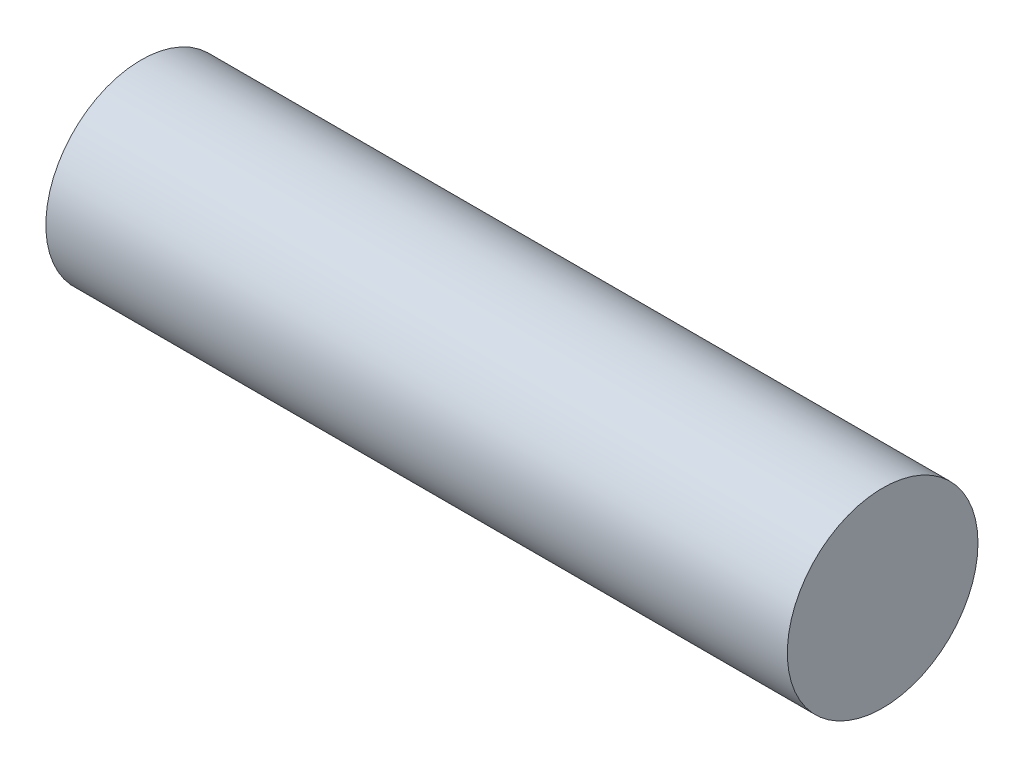
ISO-10303-21;
HEADER;
FILE_DESCRIPTION(('STEP AP214'),'2;1');
FILE_NAME('part.step','',(''),(''),'','','');
FILE_SCHEMA(('AUTOMOTIVE_DESIGN { 1 0 10303 214 1 1 1 1 }'));
ENDSEC;
DATA;
#1=APPLICATION_CONTEXT('core data for automotive mechanical design processes');
#2=APPLICATION_PROTOCOL_DEFINITION('international standard','automotive_design',2000,#1);
#3=PRODUCT_CONTEXT('',#1,'mechanical');
#4=PRODUCT('Part','Part','',(#3));
#5=PRODUCT_RELATED_PRODUCT_CATEGORY('part','',(#4));
#6=PRODUCT_DEFINITION_FORMATION('','',#4);
#7=PRODUCT_DEFINITION_CONTEXT('part definition',#1,'design');
#8=PRODUCT_DEFINITION('design','',#6,#7);
#9=PRODUCT_DEFINITION_SHAPE('','',#8);
#10=(LENGTH_UNIT() NAMED_UNIT(*) SI_UNIT(.MILLI.,.METRE.));
#11=(NAMED_UNIT(*) PLANE_ANGLE_UNIT() SI_UNIT($,.RADIAN.));
#12=(NAMED_UNIT(*) SI_UNIT($,.STERADIAN.) SOLID_ANGLE_UNIT());
#13=UNCERTAINTY_MEASURE_WITH_UNIT(LENGTH_MEASURE(1.E-05),#10,'distance_accuracy_value','');
#14=(GEOMETRIC_REPRESENTATION_CONTEXT(3) GLOBAL_UNCERTAINTY_ASSIGNED_CONTEXT((#13)) GLOBAL_UNIT_ASSIGNED_CONTEXT((#10,
#11,#12)) REPRESENTATION_CONTEXT('',''));
#15=CARTESIAN_POINT('',(0.,0.,0.));
#16=DIRECTION('',(0.,0.,1.));
#17=DIRECTION('',(1.,0.,0.));
#18=AXIS2_PLACEMENT_3D('',#15,#16,#17);
#19=CARTESIAN_POINT('',(70.,0.,0.));
#20=DIRECTION('',(-1.,0.,0.));
#21=DIRECTION('',(0.,0.,1.));
#22=AXIS2_PLACEMENT_3D('',#19,#20,#21);
#23=CYLINDRICAL_SURFACE('',#22,9.);
#24=CARTESIAN_POINT('',(70.,0.,0.));
#25=DIRECTION('',(1.,0.,0.));
#26=DIRECTION('',(0.,0.,-1.));
#27=AXIS2_PLACEMENT_3D('',#24,#25,#26);
#28=CIRCLE('',#27,9.);
#29=CARTESIAN_POINT('',(70.,0.,-9.));
#30=VERTEX_POINT('',#29);
#31=EDGE_CURVE('E10',#30,#30,#28,.T.);
#32=ORIENTED_EDGE('',*,*,#31,.F.);
#33=EDGE_LOOP('',(#32));
#34=FACE_BOUND('',#33,.T.);
#35=CARTESIAN_POINT('',(0.,0.,0.));
#36=DIRECTION('',(1.,0.,0.));
#37=DIRECTION('',(0.,0.,-1.));
#38=AXIS2_PLACEMENT_3D('',#35,#36,#37);
#39=CIRCLE('',#38,9.);
#40=CARTESIAN_POINT('',(0.,0.,-9.));
#41=VERTEX_POINT('',#40);
#42=EDGE_CURVE('E44',#41,#41,#39,.T.);
#43=ORIENTED_EDGE('',*,*,#42,.T.);
#44=EDGE_LOOP('',(#43));
#45=FACE_BOUND('',#44,.T.);
#46=ADVANCED_FACE('F41',(#34,#45),#23,.T.);
#47=CARTESIAN_POINT('',(70.,0.,0.));
#48=DIRECTION('',(1.,0.,0.));
#49=DIRECTION('',(0.,0.,-1.));
#50=AXIS2_PLACEMENT_3D('',#47,#48,#49);
#51=PLANE('',#50);
#52=ORIENTED_EDGE('',*,*,#31,.T.);
#53=EDGE_LOOP('',(#52));
#54=FACE_BOUND('',#53,.T.);
#55=ADVANCED_FACE('F58',(#54),#51,.T.);
#56=CARTESIAN_POINT('',(0.,0.,0.));
#57=DIRECTION('',(1.,0.,0.));
#58=DIRECTION('',(0.,0.,-1.));
#59=AXIS2_PLACEMENT_3D('',#56,#57,#58);
#60=PLANE('',#59);
#61=ORIENTED_EDGE('',*,*,#42,.F.);
#62=EDGE_LOOP('',(#61));
#63=FACE_BOUND('',#62,.T.);
#64=ADVANCED_FACE('F56',(#63),#60,.F.);
#65=CLOSED_SHELL('',(#46,#55,#64));
#66=MANIFOLD_SOLID_BREP('B2',#65);
#67=ADVANCED_BREP_SHAPE_REPRESENTATION('',(#18,#66),#14);
#68=SHAPE_DEFINITION_REPRESENTATION(#9,#67);
ENDSEC;
END-ISO-10303-21;
